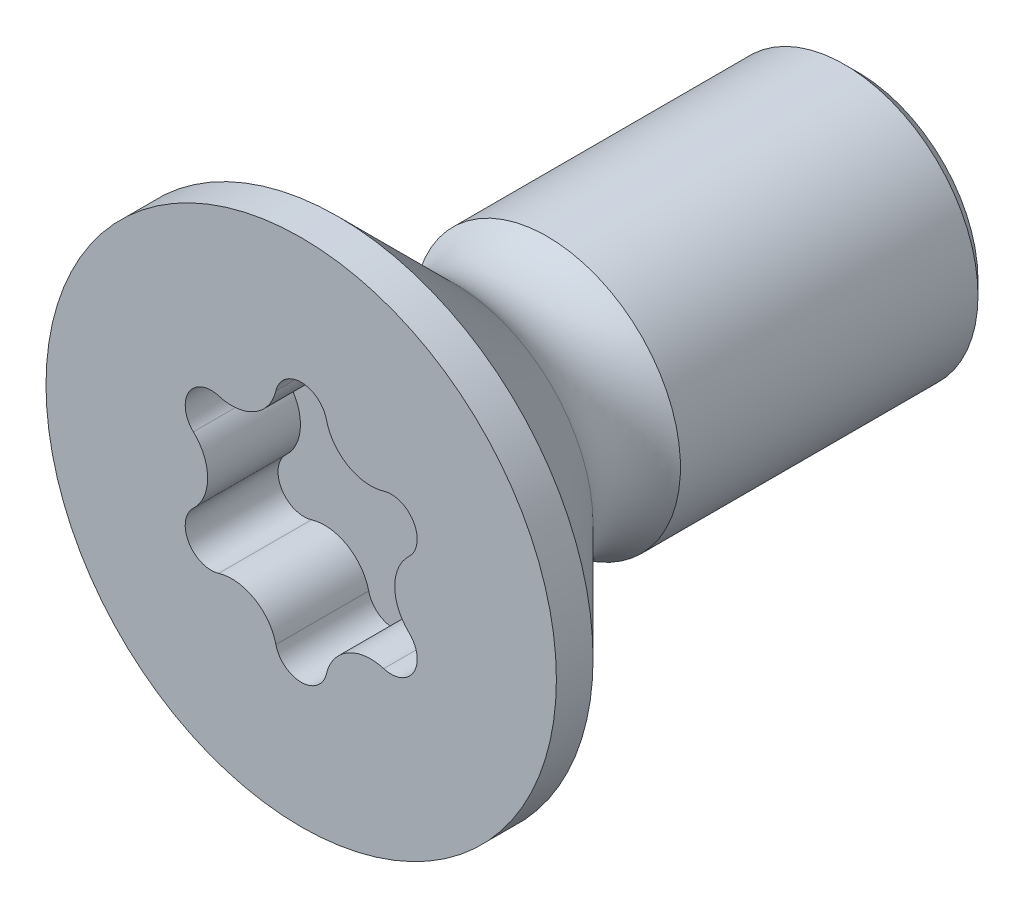
ISO-10303-21;
HEADER;
FILE_DESCRIPTION(('STEP AP214'),'2;1');
FILE_NAME('part.step','',(''),(''),'','','');
FILE_SCHEMA(('AUTOMOTIVE_DESIGN { 1 0 10303 214 1 1 1 1 }'));
ENDSEC;
DATA;
#1=APPLICATION_CONTEXT('core data for automotive mechanical design processes');
#2=APPLICATION_PROTOCOL_DEFINITION('international standard','automotive_design',2000,#1);
#3=PRODUCT_CONTEXT('',#1,'mechanical');
#4=PRODUCT('Part','Part','',(#3));
#5=PRODUCT_RELATED_PRODUCT_CATEGORY('part','',(#4));
#6=PRODUCT_DEFINITION_FORMATION('','',#4);
#7=PRODUCT_DEFINITION_CONTEXT('part definition',#1,'design');
#8=PRODUCT_DEFINITION('design','',#6,#7);
#9=PRODUCT_DEFINITION_SHAPE('','',#8);
#10=(LENGTH_UNIT() NAMED_UNIT(*) SI_UNIT(.MILLI.,.METRE.));
#11=(NAMED_UNIT(*) PLANE_ANGLE_UNIT() SI_UNIT($,.RADIAN.));
#12=(NAMED_UNIT(*) SI_UNIT($,.STERADIAN.) SOLID_ANGLE_UNIT());
#13=UNCERTAINTY_MEASURE_WITH_UNIT(LENGTH_MEASURE(1.E-05),#10,'distance_accuracy_value','');
#14=(GEOMETRIC_REPRESENTATION_CONTEXT(3) GLOBAL_UNCERTAINTY_ASSIGNED_CONTEXT((#13)) GLOBAL_UNIT_ASSIGNED_CONTEXT((#10,
#11,#12)) REPRESENTATION_CONTEXT('',''));
#15=CARTESIAN_POINT('',(0.,0.,0.));
#16=DIRECTION('',(0.,0.,1.));
#17=DIRECTION('',(1.,0.,0.));
#18=AXIS2_PLACEMENT_3D('',#15,#16,#17);
#19=CARTESIAN_POINT('',(-1.23349730334659,0.280000000000003,-1.));
#20=DIRECTION('',(0.,0.,1.));
#21=DIRECTION('',(1.,0.,0.));
#22=AXIS2_PLACEMENT_3D('',#19,#20,#21);
#23=PLANE('',#22);
#24=CARTESIAN_POINT('',(0.,1.12,-1.));
#25=DIRECTION('',(0.,0.,1.));
#26=DIRECTION('',(1.,0.,0.));
#27=AXIS2_PLACEMENT_3D('',#24,#25,#26);
#28=CIRCLE('',#27,0.280000000000002);
#29=CARTESIAN_POINT('',(0.272527806568749,1.18425414108699,-1.));
#30=VERTEX_POINT('',#29);
#31=CARTESIAN_POINT('',(-0.272527806568747,1.18425414108699,-1.));
#32=VERTEX_POINT('',#31);
#33=EDGE_CURVE('E147',#30,#32,#28,.T.);
#34=ORIENTED_EDGE('',*,*,#33,.T.);
#35=CARTESIAN_POINT('',(-0.748523077227297,1.29648000039549,-1.));
#36=DIRECTION('',(0.,0.,1.));
#37=DIRECTION('',(1.,0.,0.));
#38=AXIS2_PLACEMENT_3D('',#35,#36,#37);
#39=CIRCLE('',#38,0.489046154454607);
#40=CARTESIAN_POINT('',(-0.889330267433881,0.828143074269688,-1.));
#41=VERTEX_POINT('',#40);
#42=EDGE_CURVE('E149',#41,#32,#39,.T.);
#43=ORIENTED_EDGE('',*,*,#42,.F.);
#44=CARTESIAN_POINT('',(-0.96994845223857,0.560000000000003,-1.));
#45=DIRECTION('',(0.,0.,1.));
#46=DIRECTION('',(1.,0.,0.));
#47=AXIS2_PLACEMENT_3D('',#44,#45,#46);
#48=CIRCLE('',#47,0.280000000000002);
#49=CARTESIAN_POINT('',(-1.16185807400263,0.356111066817312,-1.));
#50=VERTEX_POINT('',#49);
#51=EDGE_CURVE('E108',#41,#50,#48,.T.);
#52=ORIENTED_EDGE('',*,*,#51,.T.);
#53=CARTESIAN_POINT('',(-1.4970461544546,0.,-1.));
#54=DIRECTION('',(0.,0.,1.));
#55=DIRECTION('',(1.,0.,0.));
#56=AXIS2_PLACEMENT_3D('',#53,#54,#55);
#57=CIRCLE('',#56,0.489046154454607);
#58=CARTESIAN_POINT('',(-1.16185807400263,-0.356111066817309,-1.));
#59=VERTEX_POINT('',#58);
#60=EDGE_CURVE('E19',#59,#50,#57,.T.);
#61=ORIENTED_EDGE('',*,*,#60,.F.);
#62=CARTESIAN_POINT('',(-0.969948452238569,-0.560000000000003,-1.));
#63=DIRECTION('',(0.,0.,1.));
#64=DIRECTION('',(1.,0.,0.));
#65=AXIS2_PLACEMENT_3D('',#62,#63,#64);
#66=CIRCLE('',#65,0.280000000000002);
#67=CARTESIAN_POINT('',(-0.889330267433884,-0.828143074269682,-1.));
#68=VERTEX_POINT('',#67);
#69=EDGE_CURVE('E105',#59,#68,#66,.T.);
#70=ORIENTED_EDGE('',*,*,#69,.T.);
#71=CARTESIAN_POINT('',(-0.748523077227306,-1.29648000039548,-1.));
#72=DIRECTION('',(0.,0.,1.));
#73=DIRECTION('',(1.,0.,0.));
#74=AXIS2_PLACEMENT_3D('',#71,#72,#73);
#75=CIRCLE('',#74,0.489046154454607);
#76=CARTESIAN_POINT('',(-0.272527806568752,-1.18425414108699,-1.));
#77=VERTEX_POINT('',#76);
#78=EDGE_CURVE('E123',#77,#68,#75,.T.);
#79=ORIENTED_EDGE('',*,*,#78,.F.);
#80=CARTESIAN_POINT('',(0.,-1.12,-1.));
#81=DIRECTION('',(0.,0.,1.));
#82=DIRECTION('',(1.,0.,0.));
#83=AXIS2_PLACEMENT_3D('',#80,#81,#82);
#84=CIRCLE('',#83,0.280000000000002);
#85=CARTESIAN_POINT('',(0.272527806568744,-1.184254141087,-1.));
#86=VERTEX_POINT('',#85);
#87=EDGE_CURVE('E126',#77,#86,#84,.T.);
#88=ORIENTED_EDGE('',*,*,#87,.T.);
#89=CARTESIAN_POINT('',(0.748523077227294,-1.29648000039549,-1.));
#90=DIRECTION('',(0.,0.,1.));
#91=DIRECTION('',(1.,0.,0.));
#92=AXIS2_PLACEMENT_3D('',#89,#90,#91);
#93=CIRCLE('',#92,0.489046154454607);
#94=CARTESIAN_POINT('',(0.889330267433881,-0.828143074269687,-1.));
#95=VERTEX_POINT('',#94);
#96=EDGE_CURVE('E128',#95,#86,#93,.T.);
#97=ORIENTED_EDGE('',*,*,#96,.F.);
#98=CARTESIAN_POINT('',(0.969948452238571,-0.560000000000001,-1.));
#99=DIRECTION('',(0.,0.,1.));
#100=DIRECTION('',(1.,0.,0.));
#101=AXIS2_PLACEMENT_3D('',#98,#99,#100);
#102=CIRCLE('',#101,0.280000000000002);
#103=CARTESIAN_POINT('',(1.16185807400263,-0.356111066817313,-1.));
#104=VERTEX_POINT('',#103);
#105=EDGE_CURVE('E133',#95,#104,#102,.T.);
#106=ORIENTED_EDGE('',*,*,#105,.T.);
#107=CARTESIAN_POINT('',(1.4970461544546,0.,-1.));
#108=DIRECTION('',(0.,0.,1.));
#109=DIRECTION('',(1.,0.,0.));
#110=AXIS2_PLACEMENT_3D('',#107,#108,#109);
#111=CIRCLE('',#110,0.489046154454607);
#112=CARTESIAN_POINT('',(1.16185807400263,0.356111066817304,-1.));
#113=VERTEX_POINT('',#112);
#114=EDGE_CURVE('E135',#113,#104,#111,.T.);
#115=ORIENTED_EDGE('',*,*,#114,.F.);
#116=CARTESIAN_POINT('',(0.969948452238569,0.560000000000002,-1.));
#117=DIRECTION('',(0.,0.,1.));
#118=DIRECTION('',(1.,0.,0.));
#119=AXIS2_PLACEMENT_3D('',#116,#117,#118);
#120=CIRCLE('',#119,0.280000000000005);
#121=CARTESIAN_POINT('',(0.889330267433883,0.828143074269683,-1.));
#122=VERTEX_POINT('',#121);
#123=EDGE_CURVE('E140',#113,#122,#120,.T.);
#124=ORIENTED_EDGE('',*,*,#123,.T.);
#125=CARTESIAN_POINT('',(0.748523077227303,1.29648000039548,-1.));
#126=DIRECTION('',(0.,0.,1.));
#127=DIRECTION('',(1.,0.,0.));
#128=AXIS2_PLACEMENT_3D('',#125,#126,#127);
#129=CIRCLE('',#128,0.489046154454607);
#130=EDGE_CURVE('E142',#30,#122,#129,.T.);
#131=ORIENTED_EDGE('',*,*,#130,.F.);
#132=EDGE_LOOP('',(#34,#43,#52,#61,#70,#79,#88,#97,#106,#115,#124,#131));
#133=FACE_BOUND('',#132,.T.);
#134=ADVANCED_FACE('F16',(#133),#23,.T.);
#135=CARTESIAN_POINT('',(-1.4970461544546,0.,-1.));
#136=DIRECTION('',(0.,0.,1.));
#137=DIRECTION('',(1.,0.,0.));
#138=AXIS2_PLACEMENT_3D('',#135,#136,#137);
#139=CYLINDRICAL_SURFACE('',#138,0.489046154454607);
#140=ORIENTED_EDGE('',*,*,#60,.T.);
#141=DIRECTION('',(0.,0.,1.));
#142=VECTOR('',#141,1.);
#143=CARTESIAN_POINT('',(-1.16185807400263,0.356111066817312,-1.));
#144=LINE('',#143,#142);
#145=CARTESIAN_POINT('',(-1.16185807400263,0.356111066817312,0.));
#146=VERTEX_POINT('',#145);
#147=EDGE_CURVE('E155',#50,#146,#144,.T.);
#148=ORIENTED_EDGE('',*,*,#147,.T.);
#149=CARTESIAN_POINT('',(-1.4970461544546,0.,0.));
#150=DIRECTION('',(0.,0.,1.));
#151=DIRECTION('',(1.,0.,0.));
#152=AXIS2_PLACEMENT_3D('',#149,#150,#151);
#153=CIRCLE('',#152,0.489046154454607);
#154=CARTESIAN_POINT('',(-1.16185807400263,-0.356111066817309,0.));
#155=VERTEX_POINT('',#154);
#156=EDGE_CURVE('E115',#146,#155,#153,.F.);
#157=ORIENTED_EDGE('',*,*,#156,.T.);
#158=DIRECTION('',(0.,0.,1.));
#159=VECTOR('',#158,1.);
#160=CARTESIAN_POINT('',(-1.16185807400263,-0.35611106681731,-1.));
#161=LINE('',#160,#159);
#162=EDGE_CURVE('E111',#155,#59,#161,.F.);
#163=ORIENTED_EDGE('',*,*,#162,.T.);
#164=EDGE_LOOP('',(#140,#148,#157,#163));
#165=FACE_BOUND('',#164,.T.);
#166=ADVANCED_FACE('F113',(#165),#139,.T.);
#167=CARTESIAN_POINT('',(-0.969948452238569,-0.560000000000003,-1.));
#168=DIRECTION('',(0.,0.,1.));
#169=DIRECTION('',(1.,0.,0.));
#170=AXIS2_PLACEMENT_3D('',#167,#168,#169);
#171=CYLINDRICAL_SURFACE('',#170,0.280000000000002);
#172=DIRECTION('',(0.,0.,1.));
#173=VECTOR('',#172,1.);
#174=CARTESIAN_POINT('',(-0.889330267433885,-0.828143074269675,-1.));
#175=LINE('',#174,#173);
#176=CARTESIAN_POINT('',(-0.889330267433884,-0.828143074269682,0.));
#177=VERTEX_POINT('',#176);
#178=EDGE_CURVE('E121',#68,#177,#175,.T.);
#179=ORIENTED_EDGE('',*,*,#178,.F.);
#180=ORIENTED_EDGE('',*,*,#69,.F.);
#181=ORIENTED_EDGE('',*,*,#162,.F.);
#182=CARTESIAN_POINT('',(-0.969948452238569,-0.560000000000003,0.));
#183=DIRECTION('',(0.,0.,1.));
#184=DIRECTION('',(1.,0.,0.));
#185=AXIS2_PLACEMENT_3D('',#182,#183,#184);
#186=CIRCLE('',#185,0.280000000000002);
#187=EDGE_CURVE('E158',#155,#177,#186,.T.);
#188=ORIENTED_EDGE('',*,*,#187,.T.);
#189=EDGE_LOOP('',(#179,#180,#181,#188));
#190=FACE_BOUND('',#189,.T.);
#191=ADVANCED_FACE('F119',(#190),#171,.F.);
#192=CARTESIAN_POINT('',(-0.748523077227306,-1.29648000039548,-1.));
#193=DIRECTION('',(0.,0.,1.));
#194=DIRECTION('',(1.,0.,0.));
#195=AXIS2_PLACEMENT_3D('',#192,#193,#194);
#196=CYLINDRICAL_SURFACE('',#195,0.489046154454607);
#197=ORIENTED_EDGE('',*,*,#78,.T.);
#198=ORIENTED_EDGE('',*,*,#178,.T.);
#199=CARTESIAN_POINT('',(-0.748523077227306,-1.29648000039548,0.));
#200=DIRECTION('',(0.,0.,1.));
#201=DIRECTION('',(1.,0.,0.));
#202=AXIS2_PLACEMENT_3D('',#199,#200,#201);
#203=CIRCLE('',#202,0.489046154454607);
#204=CARTESIAN_POINT('',(-0.272527806568752,-1.18425414108699,0.));
#205=VERTEX_POINT('',#204);
#206=EDGE_CURVE('E160',#177,#205,#203,.F.);
#207=ORIENTED_EDGE('',*,*,#206,.T.);
#208=DIRECTION('',(0.,0.,1.));
#209=VECTOR('',#208,1.);
#210=CARTESIAN_POINT('',(-0.272527806568752,-1.18425414108699,-1.));
#211=LINE('',#210,#209);
#212=EDGE_CURVE('E129',#205,#77,#211,.F.);
#213=ORIENTED_EDGE('',*,*,#212,.T.);
#214=EDGE_LOOP('',(#197,#198,#207,#213));
#215=FACE_BOUND('',#214,.T.);
#216=ADVANCED_FACE('F279',(#215),#196,.T.);
#217=CARTESIAN_POINT('',(0.,-1.12,-1.));
#218=DIRECTION('',(0.,0.,1.));
#219=DIRECTION('',(1.,0.,0.));
#220=AXIS2_PLACEMENT_3D('',#217,#218,#219);
#221=CYLINDRICAL_SURFACE('',#220,0.280000000000002);
#222=DIRECTION('',(0.,0.,1.));
#223=VECTOR('',#222,1.);
#224=CARTESIAN_POINT('',(0.27252780656874,-1.184254141087,-1.));
#225=LINE('',#224,#223);
#226=CARTESIAN_POINT('',(0.272527806568744,-1.184254141087,0.));
#227=VERTEX_POINT('',#226);
#228=EDGE_CURVE('E132',#86,#227,#225,.T.);
#229=ORIENTED_EDGE('',*,*,#228,.F.);
#230=ORIENTED_EDGE('',*,*,#87,.F.);
#231=ORIENTED_EDGE('',*,*,#212,.F.);
#232=CARTESIAN_POINT('',(0.,-1.12,0.));
#233=DIRECTION('',(0.,0.,1.));
#234=DIRECTION('',(1.,0.,0.));
#235=AXIS2_PLACEMENT_3D('',#232,#233,#234);
#236=CIRCLE('',#235,0.280000000000002);
#237=EDGE_CURVE('E162',#205,#227,#236,.T.);
#238=ORIENTED_EDGE('',*,*,#237,.T.);
#239=EDGE_LOOP('',(#229,#230,#231,#238));
#240=FACE_BOUND('',#239,.T.);
#241=ADVANCED_FACE('F275',(#240),#221,.F.);
#242=CARTESIAN_POINT('',(0.748523077227294,-1.29648000039549,-1.));
#243=DIRECTION('',(0.,0.,1.));
#244=DIRECTION('',(1.,0.,0.));
#245=AXIS2_PLACEMENT_3D('',#242,#243,#244);
#246=CYLINDRICAL_SURFACE('',#245,0.489046154454607);
#247=ORIENTED_EDGE('',*,*,#96,.T.);
#248=ORIENTED_EDGE('',*,*,#228,.T.);
#249=CARTESIAN_POINT('',(0.748523077227294,-1.29648000039549,0.));
#250=DIRECTION('',(0.,0.,1.));
#251=DIRECTION('',(1.,0.,0.));
#252=AXIS2_PLACEMENT_3D('',#249,#250,#251);
#253=CIRCLE('',#252,0.489046154454607);
#254=CARTESIAN_POINT('',(0.889330267433881,-0.828143074269687,0.));
#255=VERTEX_POINT('',#254);
#256=EDGE_CURVE('E164',#227,#255,#253,.F.);
#257=ORIENTED_EDGE('',*,*,#256,.T.);
#258=DIRECTION('',(0.,0.,1.));
#259=VECTOR('',#258,1.);
#260=CARTESIAN_POINT('',(0.889330267433881,-0.828143074269686,-1.));
#261=LINE('',#260,#259);
#262=EDGE_CURVE('E136',#255,#95,#261,.F.);
#263=ORIENTED_EDGE('',*,*,#262,.T.);
#264=EDGE_LOOP('',(#247,#248,#257,#263));
#265=FACE_BOUND('',#264,.T.);
#266=ADVANCED_FACE('F271',(#265),#246,.T.);
#267=CARTESIAN_POINT('',(0.969948452238571,-0.560000000000001,-1.));
#268=DIRECTION('',(0.,0.,1.));
#269=DIRECTION('',(1.,0.,0.));
#270=AXIS2_PLACEMENT_3D('',#267,#268,#269);
#271=CYLINDRICAL_SURFACE('',#270,0.280000000000002);
#272=DIRECTION('',(0.,0.,1.));
#273=VECTOR('',#272,1.);
#274=CARTESIAN_POINT('',(1.16185807400262,-0.356111066817315,-1.));
#275=LINE('',#274,#273);
#276=CARTESIAN_POINT('',(1.16185807400263,-0.356111066817313,0.));
#277=VERTEX_POINT('',#276);
#278=EDGE_CURVE('E139',#104,#277,#275,.T.);
#279=ORIENTED_EDGE('',*,*,#278,.F.);
#280=ORIENTED_EDGE('',*,*,#105,.F.);
#281=ORIENTED_EDGE('',*,*,#262,.F.);
#282=CARTESIAN_POINT('',(0.969948452238571,-0.560000000000001,0.));
#283=DIRECTION('',(0.,0.,1.));
#284=DIRECTION('',(1.,0.,0.));
#285=AXIS2_PLACEMENT_3D('',#282,#283,#284);
#286=CIRCLE('',#285,0.280000000000002);
#287=EDGE_CURVE('E166',#255,#277,#286,.T.);
#288=ORIENTED_EDGE('',*,*,#287,.T.);
#289=EDGE_LOOP('',(#279,#280,#281,#288));
#290=FACE_BOUND('',#289,.T.);
#291=ADVANCED_FACE('F267',(#290),#271,.F.);
#292=CARTESIAN_POINT('',(1.4970461544546,0.,-1.));
#293=DIRECTION('',(0.,0.,1.));
#294=DIRECTION('',(1.,0.,0.));
#295=AXIS2_PLACEMENT_3D('',#292,#293,#294);
#296=CYLINDRICAL_SURFACE('',#295,0.489046154454607);
#297=ORIENTED_EDGE('',*,*,#114,.T.);
#298=ORIENTED_EDGE('',*,*,#278,.T.);
#299=CARTESIAN_POINT('',(1.4970461544546,0.,0.));
#300=DIRECTION('',(0.,0.,1.));
#301=DIRECTION('',(1.,0.,0.));
#302=AXIS2_PLACEMENT_3D('',#299,#300,#301);
#303=CIRCLE('',#302,0.489046154454607);
#304=CARTESIAN_POINT('',(1.16185807400263,0.356111066817304,0.));
#305=VERTEX_POINT('',#304);
#306=EDGE_CURVE('E168',#277,#305,#303,.F.);
#307=ORIENTED_EDGE('',*,*,#306,.T.);
#308=DIRECTION('',(0.,0.,1.));
#309=VECTOR('',#308,1.);
#310=CARTESIAN_POINT('',(1.16185807400263,0.356111066817305,-1.));
#311=LINE('',#310,#309);
#312=EDGE_CURVE('E143',#305,#113,#311,.F.);
#313=ORIENTED_EDGE('',*,*,#312,.T.);
#314=EDGE_LOOP('',(#297,#298,#307,#313));
#315=FACE_BOUND('',#314,.T.);
#316=ADVANCED_FACE('F263',(#315),#296,.T.);
#317=CARTESIAN_POINT('',(0.969948452238569,0.560000000000002,-1.));
#318=DIRECTION('',(0.,0.,1.));
#319=DIRECTION('',(1.,0.,0.));
#320=AXIS2_PLACEMENT_3D('',#317,#318,#319);
#321=CYLINDRICAL_SURFACE('',#320,0.280000000000005);
#322=DIRECTION('',(0.,0.,1.));
#323=VECTOR('',#322,1.);
#324=CARTESIAN_POINT('',(0.889330267433884,0.828143074269676,-1.));
#325=LINE('',#324,#323);
#326=CARTESIAN_POINT('',(0.889330267433883,0.828143074269683,0.));
#327=VERTEX_POINT('',#326);
#328=EDGE_CURVE('E146',#122,#327,#325,.T.);
#329=ORIENTED_EDGE('',*,*,#328,.F.);
#330=ORIENTED_EDGE('',*,*,#123,.F.);
#331=ORIENTED_EDGE('',*,*,#312,.F.);
#332=CARTESIAN_POINT('',(0.969948452238569,0.560000000000002,0.));
#333=DIRECTION('',(0.,0.,1.));
#334=DIRECTION('',(1.,0.,0.));
#335=AXIS2_PLACEMENT_3D('',#332,#333,#334);
#336=CIRCLE('',#335,0.280000000000005);
#337=EDGE_CURVE('E170',#305,#327,#336,.T.);
#338=ORIENTED_EDGE('',*,*,#337,.T.);
#339=EDGE_LOOP('',(#329,#330,#331,#338));
#340=FACE_BOUND('',#339,.T.);
#341=ADVANCED_FACE('F259',(#340),#321,.F.);
#342=CARTESIAN_POINT('',(0.748523077227303,1.29648000039548,-1.));
#343=DIRECTION('',(0.,0.,1.));
#344=DIRECTION('',(1.,0.,0.));
#345=AXIS2_PLACEMENT_3D('',#342,#343,#344);
#346=CYLINDRICAL_SURFACE('',#345,0.489046154454607);
#347=ORIENTED_EDGE('',*,*,#130,.T.);
#348=ORIENTED_EDGE('',*,*,#328,.T.);
#349=CARTESIAN_POINT('',(0.748523077227303,1.29648000039548,0.));
#350=DIRECTION('',(0.,0.,1.));
#351=DIRECTION('',(1.,0.,0.));
#352=AXIS2_PLACEMENT_3D('',#349,#350,#351);
#353=CIRCLE('',#352,0.489046154454607);
#354=CARTESIAN_POINT('',(0.272527806568749,1.18425414108699,0.));
#355=VERTEX_POINT('',#354);
#356=EDGE_CURVE('E172',#327,#355,#353,.F.);
#357=ORIENTED_EDGE('',*,*,#356,.T.);
#358=DIRECTION('',(0.,0.,1.));
#359=VECTOR('',#358,1.);
#360=CARTESIAN_POINT('',(0.27252780656875,1.18425414108699,-1.));
#361=LINE('',#360,#359);
#362=EDGE_CURVE('E150',#355,#30,#361,.F.);
#363=ORIENTED_EDGE('',*,*,#362,.T.);
#364=EDGE_LOOP('',(#347,#348,#357,#363));
#365=FACE_BOUND('',#364,.T.);
#366=ADVANCED_FACE('F255',(#365),#346,.T.);
#367=CARTESIAN_POINT('',(0.,1.12,-1.));
#368=DIRECTION('',(0.,0.,1.));
#369=DIRECTION('',(1.,0.,0.));
#370=AXIS2_PLACEMENT_3D('',#367,#368,#369);
#371=CYLINDRICAL_SURFACE('',#370,0.280000000000002);
#372=DIRECTION('',(0.,0.,1.));
#373=VECTOR('',#372,1.);
#374=CARTESIAN_POINT('',(-0.272527806568745,1.18425414108699,-1.));
#375=LINE('',#374,#373);
#376=CARTESIAN_POINT('',(-0.272527806568747,1.18425414108699,0.));
#377=VERTEX_POINT('',#376);
#378=EDGE_CURVE('E153',#32,#377,#375,.T.);
#379=ORIENTED_EDGE('',*,*,#378,.F.);
#380=ORIENTED_EDGE('',*,*,#33,.F.);
#381=ORIENTED_EDGE('',*,*,#362,.F.);
#382=CARTESIAN_POINT('',(0.,1.12,0.));
#383=DIRECTION('',(0.,0.,1.));
#384=DIRECTION('',(1.,0.,0.));
#385=AXIS2_PLACEMENT_3D('',#382,#383,#384);
#386=CIRCLE('',#385,0.280000000000002);
#387=EDGE_CURVE('E174',#355,#377,#386,.T.);
#388=ORIENTED_EDGE('',*,*,#387,.T.);
#389=EDGE_LOOP('',(#379,#380,#381,#388));
#390=FACE_BOUND('',#389,.T.);
#391=ADVANCED_FACE('F252',(#390),#371,.F.);
#392=CARTESIAN_POINT('',(-0.748523077227297,1.29648000039549,-1.));
#393=DIRECTION('',(0.,0.,1.));
#394=DIRECTION('',(1.,0.,0.));
#395=AXIS2_PLACEMENT_3D('',#392,#393,#394);
#396=CYLINDRICAL_SURFACE('',#395,0.489046154454607);
#397=ORIENTED_EDGE('',*,*,#42,.T.);
#398=ORIENTED_EDGE('',*,*,#378,.T.);
#399=CARTESIAN_POINT('',(-0.748523077227297,1.29648000039549,0.));
#400=DIRECTION('',(0.,0.,1.));
#401=DIRECTION('',(1.,0.,0.));
#402=AXIS2_PLACEMENT_3D('',#399,#400,#401);
#403=CIRCLE('',#402,0.489046154454607);
#404=CARTESIAN_POINT('',(-0.889330267433881,0.828143074269688,0.));
#405=VERTEX_POINT('',#404);
#406=EDGE_CURVE('E34',#377,#405,#403,.F.);
#407=ORIENTED_EDGE('',*,*,#406,.T.);
#408=DIRECTION('',(0.,0.,1.));
#409=VECTOR('',#408,1.);
#410=CARTESIAN_POINT('',(-0.88933026743388,0.828143074269688,-1.));
#411=LINE('',#410,#409);
#412=EDGE_CURVE('E156',#405,#41,#411,.F.);
#413=ORIENTED_EDGE('',*,*,#412,.T.);
#414=EDGE_LOOP('',(#397,#398,#407,#413));
#415=FACE_BOUND('',#414,.T.);
#416=ADVANCED_FACE('F248',(#415),#396,.T.);
#417=CARTESIAN_POINT('',(-0.96994845223857,0.560000000000003,-1.));
#418=DIRECTION('',(0.,0.,1.));
#419=DIRECTION('',(1.,0.,0.));
#420=AXIS2_PLACEMENT_3D('',#417,#418,#419);
#421=CYLINDRICAL_SURFACE('',#420,0.280000000000002);
#422=ORIENTED_EDGE('',*,*,#147,.F.);
#423=ORIENTED_EDGE('',*,*,#51,.F.);
#424=ORIENTED_EDGE('',*,*,#412,.F.);
#425=CARTESIAN_POINT('',(-0.96994845223857,0.560000000000003,0.));
#426=DIRECTION('',(0.,0.,1.));
#427=DIRECTION('',(1.,0.,0.));
#428=AXIS2_PLACEMENT_3D('',#425,#426,#427);
#429=CIRCLE('',#428,0.280000000000002);
#430=EDGE_CURVE('E177',#405,#146,#429,.T.);
#431=ORIENTED_EDGE('',*,*,#430,.T.);
#432=EDGE_LOOP('',(#422,#423,#424,#431));
#433=FACE_BOUND('',#432,.T.);
#434=ADVANCED_FACE('F244',(#433),#421,.F.);
#435=CARTESIAN_POINT('',(0.,0.,0.));
#436=DIRECTION('',(0.,0.,-1.));
#437=DIRECTION('',(-1.,0.,0.));
#438=AXIS2_PLACEMENT_3D('',#435,#436,#437);
#439=PLANE('',#438);
#440=ORIENTED_EDGE('',*,*,#406,.F.);
#441=ORIENTED_EDGE('',*,*,#387,.F.);
#442=ORIENTED_EDGE('',*,*,#356,.F.);
#443=ORIENTED_EDGE('',*,*,#337,.F.);
#444=ORIENTED_EDGE('',*,*,#306,.F.);
#445=ORIENTED_EDGE('',*,*,#287,.F.);
#446=ORIENTED_EDGE('',*,*,#256,.F.);
#447=ORIENTED_EDGE('',*,*,#237,.F.);
#448=ORIENTED_EDGE('',*,*,#206,.F.);
#449=ORIENTED_EDGE('',*,*,#187,.F.);
#450=ORIENTED_EDGE('',*,*,#156,.F.);
#451=ORIENTED_EDGE('',*,*,#430,.F.);
#452=EDGE_LOOP('',(#440,#441,#442,#443,#444,#445,#446,#447,#448,#449,#450,#451));
#453=FACE_BOUND('',#452,.T.);
#454=CARTESIAN_POINT('',(0.,0.,0.));
#455=DIRECTION('',(0.,0.,-1.));
#456=DIRECTION('',(-1.,0.,0.));
#457=AXIS2_PLACEMENT_3D('',#454,#455,#456);
#458=CIRCLE('',#457,2.75);
#459=CARTESIAN_POINT('',(-2.75,0.,0.));
#460=VERTEX_POINT('',#459);
#461=EDGE_CURVE('E180',#460,#460,#458,.T.);
#462=ORIENTED_EDGE('',*,*,#461,.F.);
#463=EDGE_LOOP('',(#462));
#464=FACE_BOUND('',#463,.T.);
#465=ADVANCED_FACE('F240',(#453,#464),#439,.F.);
#466=CARTESIAN_POINT('',(0.,0.,0.));
#467=DIRECTION('',(0.,0.,-1.));
#468=DIRECTION('',(-1.,0.,0.));
#469=AXIS2_PLACEMENT_3D('',#466,#467,#468);
#470=CYLINDRICAL_SURFACE('',#469,2.75);
#471=ORIENTED_EDGE('',*,*,#461,.T.);
#472=EDGE_LOOP('',(#471));
#473=FACE_BOUND('',#472,.T.);
#474=CARTESIAN_POINT('',(0.,0.,-0.395301530829784));
#475=DIRECTION('',(0.,0.,1.));
#476=DIRECTION('',(1.,0.,0.));
#477=AXIS2_PLACEMENT_3D('',#474,#475,#476);
#478=CIRCLE('',#477,2.74999999999181);
#479=CARTESIAN_POINT('',(2.74999999999181,0.,-0.395301530829784));
#480=VERTEX_POINT('',#479);
#481=EDGE_CURVE('E183',#480,#480,#478,.F.);
#482=ORIENTED_EDGE('',*,*,#481,.F.);
#483=EDGE_LOOP('',(#482));
#484=FACE_BOUND('',#483,.T.);
#485=ADVANCED_FACE('F236',(#473,#484),#470,.T.);
#486=CARTESIAN_POINT('',(0.,1.437,-6.));
#487=DIRECTION('',(0.,0.,1.));
#488=DIRECTION('',(1.,0.,0.));
#489=AXIS2_PLACEMENT_3D('',#486,#487,#488);
#490=PLANE('',#489);
#491=CARTESIAN_POINT('',(0.,0.,-5.99999999997181));
#492=DIRECTION('',(0.,0.,1.));
#493=DIRECTION('',(1.,0.,0.));
#494=AXIS2_PLACEMENT_3D('',#491,#492,#493);
#495=CIRCLE('',#494,1.29329999998617);
#496=CARTESIAN_POINT('',(1.29329999998617,0.,-5.99999999997181));
#497=VERTEX_POINT('',#496);
#498=EDGE_CURVE('E184',#497,#497,#495,.T.);
#499=ORIENTED_EDGE('',*,*,#498,.F.);
#500=EDGE_LOOP('',(#499));
#501=FACE_BOUND('',#500,.T.);
#502=ADVANCED_FACE('F232',(#501),#490,.F.);
#503=CARTESIAN_POINT('',(0.,0.,-0.395301530829784));
#504=DIRECTION('',(0.,0.,1.));
#505=DIRECTION('',(0.,-1.,0.));
#506=AXIS2_PLACEMENT_3D('',#503,#504,#505);
#507=CONICAL_SURFACE('',#506,2.74999999999181,0.78539816249136);
#508=ORIENTED_EDGE('',*,*,#481,.T.);
#509=EDGE_LOOP('',(#508));
#510=FACE_BOUND('',#509,.T.);
#511=CARTESIAN_POINT('',(0.,0.,-1.65));
#512=DIRECTION('',(0.,0.,-1.));
#513=DIRECTION('',(-1.,0.,0.));
#514=AXIS2_PLACEMENT_3D('',#511,#512,#513);
#515=CIRCLE('',#514,1.49530153091274);
#516=CARTESIAN_POINT('',(-1.49530153091274,0.,-1.65));
#517=VERTEX_POINT('',#516);
#518=EDGE_CURVE('E186',#517,#517,#515,.F.);
#519=ORIENTED_EDGE('',*,*,#518,.T.);
#520=EDGE_LOOP('',(#519));
#521=FACE_BOUND('',#520,.T.);
#522=ADVANCED_FACE('F228',(#510,#521),#507,.T.);
#523=CARTESIAN_POINT('',(0.,0.,-5.85629999983439));
#524=DIRECTION('',(0.,0.,1.));
#525=DIRECTION('',(1.,0.,0.));
#526=AXIS2_PLACEMENT_3D('',#523,#524,#525);
#527=CONICAL_SURFACE('',#526,1.43699999989622,0.785398162606308);
#528=ORIENTED_EDGE('',*,*,#498,.T.);
#529=EDGE_LOOP('',(#528));
#530=FACE_BOUND('',#529,.T.);
#531=CARTESIAN_POINT('',(0.,0.,-5.8563));
#532=DIRECTION('',(0.,0.,-1.));
#533=DIRECTION('',(-1.,0.,0.));
#534=AXIS2_PLACEMENT_3D('',#531,#532,#533);
#535=CIRCLE('',#534,1.437);
#536=CARTESIAN_POINT('',(-1.437,0.,-5.8563));
#537=VERTEX_POINT('',#536);
#538=EDGE_CURVE('E25',#537,#537,#535,.F.);
#539=ORIENTED_EDGE('',*,*,#538,.F.);
#540=EDGE_LOOP('',(#539));
#541=FACE_BOUND('',#540,.T.);
#542=ADVANCED_FACE('F224',(#530,#541),#527,.T.);
#543=CARTESIAN_POINT('',(0.,0.,-2.18276027382699));
#544=DIRECTION('',(0.,0.,-1.));
#545=DIRECTION('',(-1.,0.,0.));
#546=AXIS2_PLACEMENT_3D('',#543,#544,#545);
#547=TOROIDAL_SURFACE('',#546,2.02806180473973,0.753436804739734);
#548=ORIENTED_EDGE('',*,*,#518,.F.);
#549=EDGE_LOOP('',(#548));
#550=FACE_BOUND('',#549,.T.);
#551=CARTESIAN_POINT('',(0.,0.,-2.65));
#552=DIRECTION('',(0.,0.,-1.));
#553=DIRECTION('',(-1.,0.,0.));
#554=AXIS2_PLACEMENT_3D('',#551,#552,#553);
#555=CIRCLE('',#554,1.437);
#556=CARTESIAN_POINT('',(-1.437,0.,-2.65));
#557=VERTEX_POINT('',#556);
#558=EDGE_CURVE('E11',#557,#557,#555,.T.);
#559=ORIENTED_EDGE('',*,*,#558,.F.);
#560=EDGE_LOOP('',(#559));
#561=FACE_BOUND('',#560,.T.);
#562=ADVANCED_FACE('F219',(#550,#561),#547,.F.);
#563=CARTESIAN_POINT('',(0.,0.,0.));
#564=DIRECTION('',(0.,0.,-1.));
#565=DIRECTION('',(-1.,0.,0.));
#566=AXIS2_PLACEMENT_3D('',#563,#564,#565);
#567=CYLINDRICAL_SURFACE('',#566,1.437);
#568=ORIENTED_EDGE('',*,*,#558,.T.);
#569=EDGE_LOOP('',(#568));
#570=FACE_BOUND('',#569,.T.);
#571=ORIENTED_EDGE('',*,*,#538,.T.);
#572=EDGE_LOOP('',(#571));
#573=FACE_BOUND('',#572,.T.);
#574=ADVANCED_FACE('F223',(#570,#573),#567,.T.);
#575=CLOSED_SHELL('',(#134,#166,#191,#216,#241,#266,#291,#316,#341,#366,#391,#416,#434,#465,
#485,#502,#522,#542,#562,#574));
#576=MANIFOLD_SOLID_BREP('B1',#575);
#577=ADVANCED_BREP_SHAPE_REPRESENTATION('',(#18,#576),#14);
#578=SHAPE_DEFINITION_REPRESENTATION(#9,#577);
ENDSEC;
END-ISO-10303-21;
